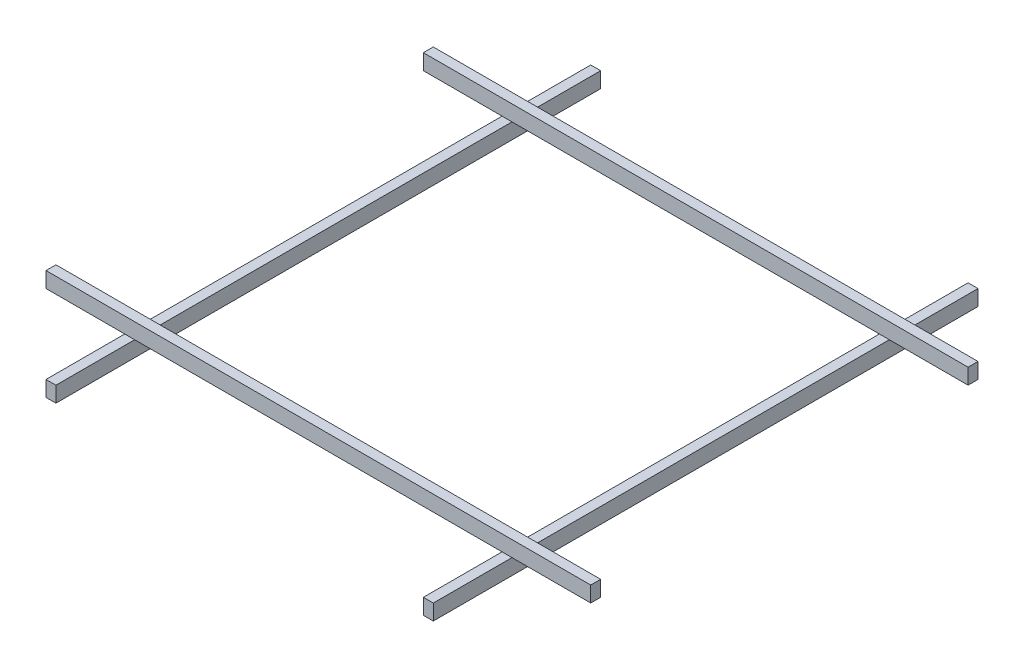
ISO-10303-21;
HEADER;
FILE_DESCRIPTION(('STEP AP214'),'2;1');
FILE_NAME('part.step','',(''),(''),'','','');
FILE_SCHEMA(('AUTOMOTIVE_DESIGN { 1 0 10303 214 1 1 1 1 }'));
ENDSEC;
DATA;
#1=APPLICATION_CONTEXT('core data for automotive mechanical design processes');
#2=APPLICATION_PROTOCOL_DEFINITION('international standard','automotive_design',2000,#1);
#3=PRODUCT_CONTEXT('',#1,'mechanical');
#4=PRODUCT('Part','Part','',(#3));
#5=PRODUCT_RELATED_PRODUCT_CATEGORY('part','',(#4));
#6=PRODUCT_DEFINITION_FORMATION('','',#4);
#7=PRODUCT_DEFINITION_CONTEXT('part definition',#1,'design');
#8=PRODUCT_DEFINITION('design','',#6,#7);
#9=PRODUCT_DEFINITION_SHAPE('','',#8);
#10=(LENGTH_UNIT() NAMED_UNIT(*) SI_UNIT(.MILLI.,.METRE.));
#11=(NAMED_UNIT(*) PLANE_ANGLE_UNIT() SI_UNIT($,.RADIAN.));
#12=(NAMED_UNIT(*) SI_UNIT($,.STERADIAN.) SOLID_ANGLE_UNIT());
#13=UNCERTAINTY_MEASURE_WITH_UNIT(LENGTH_MEASURE(1.E-05),#10,'distance_accuracy_value','');
#14=(GEOMETRIC_REPRESENTATION_CONTEXT(3) GLOBAL_UNCERTAINTY_ASSIGNED_CONTEXT((#13)) GLOBAL_UNIT_ASSIGNED_CONTEXT((#10,
#11,#12)) REPRESENTATION_CONTEXT('',''));
#15=CARTESIAN_POINT('',(0.,0.,0.));
#16=DIRECTION('',(0.,0.,1.));
#17=DIRECTION('',(1.,0.,0.));
#18=AXIS2_PLACEMENT_3D('',#15,#16,#17);
#19=CARTESIAN_POINT('',(4572.,209.55,-793.749999999999));
#20=DIRECTION('',(0.,0.,1.));
#21=DIRECTION('',(1.,0.,0.));
#22=AXIS2_PLACEMENT_3D('',#19,#20,#21);
#23=PLANE('',#22);
#24=DIRECTION('',(0.,1.,0.));
#25=VECTOR('',#24,1.);
#26=CARTESIAN_POINT('',(-304.8,209.55,-793.749999999999));
#27=LINE('',#26,#25);
#28=CARTESIAN_POINT('',(-304.8,69.85,-793.749999999999));
#29=VERTEX_POINT('',#28);
#30=CARTESIAN_POINT('',(-304.8,209.55,-793.749999999999));
#31=VERTEX_POINT('',#30);
#32=EDGE_CURVE('E141',#29,#31,#27,.T.);
#33=ORIENTED_EDGE('',*,*,#32,.T.);
#34=DIRECTION('',(-1.,0.,0.));
#35=VECTOR('',#34,1.);
#36=CARTESIAN_POINT('',(4572.,209.55,-793.749999999999));
#37=LINE('',#36,#35);
#38=CARTESIAN_POINT('',(4572.,209.55,-793.749999999999));
#39=VERTEX_POINT('',#38);
#40=EDGE_CURVE('E13',#39,#31,#37,.T.);
#41=ORIENTED_EDGE('',*,*,#40,.F.);
#42=DIRECTION('',(0.,1.,0.));
#43=VECTOR('',#42,1.);
#44=CARTESIAN_POINT('',(4572.,209.55,-793.749999999999));
#45=LINE('',#44,#43);
#46=CARTESIAN_POINT('',(4572.,69.85,-793.749999999999));
#47=VERTEX_POINT('',#46);
#48=EDGE_CURVE('E126',#47,#39,#45,.T.);
#49=ORIENTED_EDGE('',*,*,#48,.F.);
#50=DIRECTION('',(-1.,0.,0.));
#51=VECTOR('',#50,1.);
#52=CARTESIAN_POINT('',(4572.,69.85,-793.749999999999));
#53=LINE('',#52,#51);
#54=EDGE_CURVE('E137',#47,#29,#53,.T.);
#55=ORIENTED_EDGE('',*,*,#54,.T.);
#56=EDGE_LOOP('',(#33,#41,#49,#55));
#57=FACE_BOUND('',#56,.T.);
#58=ADVANCED_FACE('F72',(#57),#23,.F.);
#59=CARTESIAN_POINT('',(4572.,209.55,-704.849999999999));
#60=DIRECTION('',(0.,-1.,0.));
#61=DIRECTION('',(0.,0.,-1.));
#62=AXIS2_PLACEMENT_3D('',#59,#60,#61);
#63=PLANE('',#62);
#64=DIRECTION('',(0.,0.,1.));
#65=VECTOR('',#64,1.);
#66=CARTESIAN_POINT('',(-304.8,209.55,-704.849999999999));
#67=LINE('',#66,#65);
#68=CARTESIAN_POINT('',(-304.8,209.55,-704.849999999999));
#69=VERTEX_POINT('',#68);
#70=EDGE_CURVE('E130',#31,#69,#67,.T.);
#71=ORIENTED_EDGE('',*,*,#70,.T.);
#72=DIRECTION('',(-1.,0.,0.));
#73=VECTOR('',#72,1.);
#74=CARTESIAN_POINT('',(4572.,209.55,-704.849999999999));
#75=LINE('',#74,#73);
#76=CARTESIAN_POINT('',(4572.,209.55,-704.849999999999));
#77=VERTEX_POINT('',#76);
#78=EDGE_CURVE('E81',#77,#69,#75,.T.);
#79=ORIENTED_EDGE('',*,*,#78,.F.);
#80=DIRECTION('',(0.,0.,1.));
#81=VECTOR('',#80,1.);
#82=CARTESIAN_POINT('',(4572.,209.55,-704.849999999999));
#83=LINE('',#82,#81);
#84=EDGE_CURVE('E121',#39,#77,#83,.T.);
#85=ORIENTED_EDGE('',*,*,#84,.F.);
#86=ORIENTED_EDGE('',*,*,#40,.T.);
#87=EDGE_LOOP('',(#71,#79,#85,#86));
#88=FACE_BOUND('',#87,.T.);
#89=ADVANCED_FACE('F129',(#88),#63,.F.);
#90=CARTESIAN_POINT('',(4572.,209.55,-704.849999999999));
#91=DIRECTION('',(0.,0.,-1.));
#92=DIRECTION('',(-1.,0.,0.));
#93=AXIS2_PLACEMENT_3D('',#90,#91,#92);
#94=PLANE('',#93);
#95=DIRECTION('',(0.,-1.,0.));
#96=VECTOR('',#95,1.);
#97=CARTESIAN_POINT('',(-304.8,209.55,-704.849999999999));
#98=LINE('',#97,#96);
#99=CARTESIAN_POINT('',(-304.8,69.85,-704.849999999999));
#100=VERTEX_POINT('',#99);
#101=EDGE_CURVE('E108',#69,#100,#98,.T.);
#102=ORIENTED_EDGE('',*,*,#101,.T.);
#103=DIRECTION('',(-1.,0.,0.));
#104=VECTOR('',#103,1.);
#105=CARTESIAN_POINT('',(4572.,69.85,-704.849999999999));
#106=LINE('',#105,#104);
#107=CARTESIAN_POINT('',(4572.,69.85,-704.849999999999));
#108=VERTEX_POINT('',#107);
#109=EDGE_CURVE('E132',#108,#100,#106,.T.);
#110=ORIENTED_EDGE('',*,*,#109,.F.);
#111=DIRECTION('',(0.,-1.,0.));
#112=VECTOR('',#111,1.);
#113=CARTESIAN_POINT('',(4572.,209.55,-704.849999999999));
#114=LINE('',#113,#112);
#115=EDGE_CURVE('E124',#77,#108,#114,.T.);
#116=ORIENTED_EDGE('',*,*,#115,.F.);
#117=ORIENTED_EDGE('',*,*,#78,.T.);
#118=EDGE_LOOP('',(#102,#110,#116,#117));
#119=FACE_BOUND('',#118,.T.);
#120=ADVANCED_FACE('F133',(#119),#94,.F.);
#121=CARTESIAN_POINT('',(4572.,69.85,-704.849999999999));
#122=DIRECTION('',(0.,1.,0.));
#123=DIRECTION('',(0.,0.,1.));
#124=AXIS2_PLACEMENT_3D('',#121,#122,#123);
#125=PLANE('',#124);
#126=DIRECTION('',(0.,0.,-1.));
#127=VECTOR('',#126,1.);
#128=CARTESIAN_POINT('',(-304.8,69.85,-704.849999999999));
#129=LINE('',#128,#127);
#130=EDGE_CURVE('E114',#100,#29,#129,.T.);
#131=ORIENTED_EDGE('',*,*,#130,.T.);
#132=ORIENTED_EDGE('',*,*,#54,.F.);
#133=DIRECTION('',(0.,0.,-1.));
#134=VECTOR('',#133,1.);
#135=CARTESIAN_POINT('',(4572.,69.85,-704.849999999999));
#136=LINE('',#135,#134);
#137=EDGE_CURVE('E91',#108,#47,#136,.T.);
#138=ORIENTED_EDGE('',*,*,#137,.F.);
#139=ORIENTED_EDGE('',*,*,#109,.T.);
#140=EDGE_LOOP('',(#131,#132,#138,#139));
#141=FACE_BOUND('',#140,.T.);
#142=ADVANCED_FACE('F151',(#141),#125,.F.);
#143=CARTESIAN_POINT('',(4572.,139.7,-1193.8));
#144=DIRECTION('',(1.,0.,0.));
#145=DIRECTION('',(0.,0.,-1.));
#146=AXIS2_PLACEMENT_3D('',#143,#144,#145);
#147=PLANE('',#146);
#148=ORIENTED_EDGE('',*,*,#48,.T.);
#149=ORIENTED_EDGE('',*,*,#84,.T.);
#150=ORIENTED_EDGE('',*,*,#115,.T.);
#151=ORIENTED_EDGE('',*,*,#137,.T.);
#152=EDGE_LOOP('',(#148,#149,#150,#151));
#153=FACE_BOUND('',#152,.T.);
#154=ADVANCED_FACE('F122',(#153),#147,.T.);
#155=CARTESIAN_POINT('',(-304.8,139.7,-1193.8));
#156=DIRECTION('',(1.,0.,0.));
#157=DIRECTION('',(0.,0.,-1.));
#158=AXIS2_PLACEMENT_3D('',#155,#156,#157);
#159=PLANE('',#158);
#160=ORIENTED_EDGE('',*,*,#32,.F.);
#161=ORIENTED_EDGE('',*,*,#130,.F.);
#162=ORIENTED_EDGE('',*,*,#101,.F.);
#163=ORIENTED_EDGE('',*,*,#70,.F.);
#164=EDGE_LOOP('',(#160,#161,#162,#163));
#165=FACE_BOUND('',#164,.T.);
#166=ADVANCED_FACE('F154',(#165),#159,.F.);
#167=CLOSED_SHELL('',(#58,#89,#120,#142,#154,#166));
#168=MANIFOLD_SOLID_BREP('B2',#167);
#169=CARTESIAN_POINT('',(4572.,209.55,-4171.95));
#170=DIRECTION('',(0.,0.,1.));
#171=DIRECTION('',(1.,0.,0.));
#172=AXIS2_PLACEMENT_3D('',#169,#170,#171);
#173=PLANE('',#172);
#174=DIRECTION('',(0.,1.,0.));
#175=VECTOR('',#174,1.);
#176=CARTESIAN_POINT('',(-304.8,209.55,-4171.95));
#177=LINE('',#176,#175);
#178=CARTESIAN_POINT('',(-304.8,69.85,-4171.95));
#179=VERTEX_POINT('',#178);
#180=CARTESIAN_POINT('',(-304.8,209.55,-4171.95));
#181=VERTEX_POINT('',#180);
#182=EDGE_CURVE('E304',#179,#181,#177,.T.);
#183=ORIENTED_EDGE('',*,*,#182,.T.);
#184=DIRECTION('',(-1.,0.,0.));
#185=VECTOR('',#184,1.);
#186=CARTESIAN_POINT('',(4572.,209.55,-4171.95));
#187=LINE('',#186,#185);
#188=CARTESIAN_POINT('',(4572.,209.55,-4171.95));
#189=VERTEX_POINT('',#188);
#190=EDGE_CURVE('E70',#189,#181,#187,.T.);
#191=ORIENTED_EDGE('',*,*,#190,.F.);
#192=DIRECTION('',(0.,1.,0.));
#193=VECTOR('',#192,1.);
#194=CARTESIAN_POINT('',(4572.,209.55,-4171.95));
#195=LINE('',#194,#193);
#196=CARTESIAN_POINT('',(4572.,69.85,-4171.95));
#197=VERTEX_POINT('',#196);
#198=EDGE_CURVE('E291',#197,#189,#195,.T.);
#199=ORIENTED_EDGE('',*,*,#198,.F.);
#200=DIRECTION('',(-1.,0.,0.));
#201=VECTOR('',#200,1.);
#202=CARTESIAN_POINT('',(4572.,69.85,-4171.95));
#203=LINE('',#202,#201);
#204=EDGE_CURVE('E300',#197,#179,#203,.T.);
#205=ORIENTED_EDGE('',*,*,#204,.T.);
#206=EDGE_LOOP('',(#183,#191,#199,#205));
#207=FACE_BOUND('',#206,.T.);
#208=ADVANCED_FACE('F239',(#207),#173,.F.);
#209=CARTESIAN_POINT('',(4572.,209.55,-4083.05));
#210=DIRECTION('',(0.,-1.,0.));
#211=DIRECTION('',(0.,0.,-1.));
#212=AXIS2_PLACEMENT_3D('',#209,#210,#211);
#213=PLANE('',#212);
#214=DIRECTION('',(0.,0.,1.));
#215=VECTOR('',#214,1.);
#216=CARTESIAN_POINT('',(-304.8,209.55,-4083.05));
#217=LINE('',#216,#215);
#218=CARTESIAN_POINT('',(-304.8,209.55,-4083.05));
#219=VERTEX_POINT('',#218);
#220=EDGE_CURVE('E295',#181,#219,#217,.T.);
#221=ORIENTED_EDGE('',*,*,#220,.T.);
#222=DIRECTION('',(-1.,0.,0.));
#223=VECTOR('',#222,1.);
#224=CARTESIAN_POINT('',(4572.,209.55,-4083.05));
#225=LINE('',#224,#223);
#226=CARTESIAN_POINT('',(4572.,209.55,-4083.05));
#227=VERTEX_POINT('',#226);
#228=EDGE_CURVE('E248',#227,#219,#225,.T.);
#229=ORIENTED_EDGE('',*,*,#228,.F.);
#230=DIRECTION('',(0.,0.,1.));
#231=VECTOR('',#230,1.);
#232=CARTESIAN_POINT('',(4572.,209.55,-4083.05));
#233=LINE('',#232,#231);
#234=EDGE_CURVE('E286',#189,#227,#233,.T.);
#235=ORIENTED_EDGE('',*,*,#234,.F.);
#236=ORIENTED_EDGE('',*,*,#190,.T.);
#237=EDGE_LOOP('',(#221,#229,#235,#236));
#238=FACE_BOUND('',#237,.T.);
#239=ADVANCED_FACE('F294',(#238),#213,.F.);
#240=CARTESIAN_POINT('',(4572.,209.55,-4083.05));
#241=DIRECTION('',(0.,0.,-1.));
#242=DIRECTION('',(-1.,0.,0.));
#243=AXIS2_PLACEMENT_3D('',#240,#241,#242);
#244=PLANE('',#243);
#245=DIRECTION('',(0.,-1.,0.));
#246=VECTOR('',#245,1.);
#247=CARTESIAN_POINT('',(-304.8,209.55,-4083.05));
#248=LINE('',#247,#246);
#249=CARTESIAN_POINT('',(-304.8,69.85,-4083.05));
#250=VERTEX_POINT('',#249);
#251=EDGE_CURVE('E273',#219,#250,#248,.T.);
#252=ORIENTED_EDGE('',*,*,#251,.T.);
#253=DIRECTION('',(-1.,0.,0.));
#254=VECTOR('',#253,1.);
#255=CARTESIAN_POINT('',(4572.,69.85,-4083.05));
#256=LINE('',#255,#254);
#257=CARTESIAN_POINT('',(4572.,69.85,-4083.05));
#258=VERTEX_POINT('',#257);
#259=EDGE_CURVE('E297',#258,#250,#256,.T.);
#260=ORIENTED_EDGE('',*,*,#259,.F.);
#261=DIRECTION('',(0.,-1.,0.));
#262=VECTOR('',#261,1.);
#263=CARTESIAN_POINT('',(4572.,209.55,-4083.05));
#264=LINE('',#263,#262);
#265=EDGE_CURVE('E289',#227,#258,#264,.T.);
#266=ORIENTED_EDGE('',*,*,#265,.F.);
#267=ORIENTED_EDGE('',*,*,#228,.T.);
#268=EDGE_LOOP('',(#252,#260,#266,#267));
#269=FACE_BOUND('',#268,.T.);
#270=ADVANCED_FACE('F298',(#269),#244,.F.);
#271=CARTESIAN_POINT('',(4572.,69.85,-4083.05));
#272=DIRECTION('',(0.,1.,0.));
#273=DIRECTION('',(0.,0.,1.));
#274=AXIS2_PLACEMENT_3D('',#271,#272,#273);
#275=PLANE('',#274);
#276=DIRECTION('',(0.,0.,-1.));
#277=VECTOR('',#276,1.);
#278=CARTESIAN_POINT('',(-304.8,69.85,-4083.05));
#279=LINE('',#278,#277);
#280=EDGE_CURVE('E279',#250,#179,#279,.T.);
#281=ORIENTED_EDGE('',*,*,#280,.T.);
#282=ORIENTED_EDGE('',*,*,#204,.F.);
#283=DIRECTION('',(0.,0.,-1.));
#284=VECTOR('',#283,1.);
#285=CARTESIAN_POINT('',(4572.,69.85,-4083.05));
#286=LINE('',#285,#284);
#287=EDGE_CURVE('E256',#258,#197,#286,.T.);
#288=ORIENTED_EDGE('',*,*,#287,.F.);
#289=ORIENTED_EDGE('',*,*,#259,.T.);
#290=EDGE_LOOP('',(#281,#282,#288,#289));
#291=FACE_BOUND('',#290,.T.);
#292=ADVANCED_FACE('F313',(#291),#275,.F.);
#293=CARTESIAN_POINT('',(4572.,139.7,-4572.));
#294=DIRECTION('',(1.,0.,0.));
#295=DIRECTION('',(0.,0.,-1.));
#296=AXIS2_PLACEMENT_3D('',#293,#294,#295);
#297=PLANE('',#296);
#298=ORIENTED_EDGE('',*,*,#198,.T.);
#299=ORIENTED_EDGE('',*,*,#234,.T.);
#300=ORIENTED_EDGE('',*,*,#265,.T.);
#301=ORIENTED_EDGE('',*,*,#287,.T.);
#302=EDGE_LOOP('',(#298,#299,#300,#301));
#303=FACE_BOUND('',#302,.T.);
#304=ADVANCED_FACE('F287',(#303),#297,.T.);
#305=CARTESIAN_POINT('',(-304.8,139.7,-4572.));
#306=DIRECTION('',(1.,0.,0.));
#307=DIRECTION('',(0.,0.,-1.));
#308=AXIS2_PLACEMENT_3D('',#305,#306,#307);
#309=PLANE('',#308);
#310=ORIENTED_EDGE('',*,*,#182,.F.);
#311=ORIENTED_EDGE('',*,*,#280,.F.);
#312=ORIENTED_EDGE('',*,*,#251,.F.);
#313=ORIENTED_EDGE('',*,*,#220,.F.);
#314=EDGE_LOOP('',(#310,#311,#312,#313));
#315=FACE_BOUND('',#314,.T.);
#316=ADVANCED_FACE('F316',(#315),#309,.F.);
#317=CLOSED_SHELL('',(#208,#239,#270,#292,#304,#316));
#318=MANIFOLD_SOLID_BREP('B7',#317);
#319=CARTESIAN_POINT('',(3778.25,69.85,-4876.8));
#320=DIRECTION('',(1.,0.,0.));
#321=DIRECTION('',(0.,0.,-1.));
#322=AXIS2_PLACEMENT_3D('',#319,#320,#321);
#323=PLANE('',#322);
#324=DIRECTION('',(0.,1.,0.));
#325=VECTOR('',#324,1.);
#326=CARTESIAN_POINT('',(3778.25,69.85,0.));
#327=LINE('',#326,#325);
#328=CARTESIAN_POINT('',(3778.25,-69.85,0.));
#329=VERTEX_POINT('',#328);
#330=CARTESIAN_POINT('',(3778.25,69.85,0.));
#331=VERTEX_POINT('',#330);
#332=EDGE_CURVE('E474',#329,#331,#327,.T.);
#333=ORIENTED_EDGE('',*,*,#332,.T.);
#334=DIRECTION('',(0.,0.,1.));
#335=VECTOR('',#334,1.);
#336=CARTESIAN_POINT('',(3778.25,69.85,-4876.8));
#337=LINE('',#336,#335);
#338=CARTESIAN_POINT('',(3778.25,69.85,-4876.8));
#339=VERTEX_POINT('',#338);
#340=EDGE_CURVE('E237',#339,#331,#337,.T.);
#341=ORIENTED_EDGE('',*,*,#340,.F.);
#342=DIRECTION('',(0.,1.,0.));
#343=VECTOR('',#342,1.);
#344=CARTESIAN_POINT('',(3778.25,69.85,-4876.8));
#345=LINE('',#344,#343);
#346=CARTESIAN_POINT('',(3778.25,-69.85,-4876.8));
#347=VERTEX_POINT('',#346);
#348=EDGE_CURVE('E458',#347,#339,#345,.T.);
#349=ORIENTED_EDGE('',*,*,#348,.F.);
#350=DIRECTION('',(0.,0.,1.));
#351=VECTOR('',#350,1.);
#352=CARTESIAN_POINT('',(3778.25,-69.85,-4876.8));
#353=LINE('',#352,#351);
#354=EDGE_CURVE('E470',#347,#329,#353,.T.);
#355=ORIENTED_EDGE('',*,*,#354,.T.);
#356=EDGE_LOOP('',(#333,#341,#349,#355));
#357=FACE_BOUND('',#356,.T.);
#358=ADVANCED_FACE('F402',(#357),#323,.F.);
#359=CARTESIAN_POINT('',(3867.15,69.85,-4876.8));
#360=DIRECTION('',(0.,-1.,0.));
#361=DIRECTION('',(0.,0.,-1.));
#362=AXIS2_PLACEMENT_3D('',#359,#360,#361);
#363=PLANE('',#362);
#364=DIRECTION('',(1.,0.,0.));
#365=VECTOR('',#364,1.);
#366=CARTESIAN_POINT('',(3867.15,69.85,0.));
#367=LINE('',#366,#365);
#368=CARTESIAN_POINT('',(3867.15,69.85,0.));
#369=VERTEX_POINT('',#368);
#370=EDGE_CURVE('E462',#331,#369,#367,.T.);
#371=ORIENTED_EDGE('',*,*,#370,.T.);
#372=DIRECTION('',(0.,0.,1.));
#373=VECTOR('',#372,1.);
#374=CARTESIAN_POINT('',(3867.15,69.85,-4876.8));
#375=LINE('',#374,#373);
#376=CARTESIAN_POINT('',(3867.15,69.85,-4876.8));
#377=VERTEX_POINT('',#376);
#378=EDGE_CURVE('E411',#377,#369,#375,.T.);
#379=ORIENTED_EDGE('',*,*,#378,.F.);
#380=DIRECTION('',(1.,0.,0.));
#381=VECTOR('',#380,1.);
#382=CARTESIAN_POINT('',(3867.15,69.85,-4876.8));
#383=LINE('',#382,#381);
#384=EDGE_CURVE('E453',#339,#377,#383,.T.);
#385=ORIENTED_EDGE('',*,*,#384,.F.);
#386=ORIENTED_EDGE('',*,*,#340,.T.);
#387=EDGE_LOOP('',(#371,#379,#385,#386));
#388=FACE_BOUND('',#387,.T.);
#389=ADVANCED_FACE('F461',(#388),#363,.F.);
#390=CARTESIAN_POINT('',(3867.15,69.85,-4876.8));
#391=DIRECTION('',(-1.,0.,0.));
#392=DIRECTION('',(0.,0.,1.));
#393=AXIS2_PLACEMENT_3D('',#390,#391,#392);
#394=PLANE('',#393);
#395=DIRECTION('',(0.,-1.,0.));
#396=VECTOR('',#395,1.);
#397=CARTESIAN_POINT('',(3867.15,69.85,0.));
#398=LINE('',#397,#396);
#399=CARTESIAN_POINT('',(3867.15,-69.85,0.));
#400=VERTEX_POINT('',#399);
#401=EDGE_CURVE('E440',#369,#400,#398,.T.);
#402=ORIENTED_EDGE('',*,*,#401,.T.);
#403=DIRECTION('',(0.,0.,1.));
#404=VECTOR('',#403,1.);
#405=CARTESIAN_POINT('',(3867.15,-69.85,-4876.8));
#406=LINE('',#405,#404);
#407=CARTESIAN_POINT('',(3867.15,-69.85,-4876.8));
#408=VERTEX_POINT('',#407);
#409=EDGE_CURVE('E464',#408,#400,#406,.T.);
#410=ORIENTED_EDGE('',*,*,#409,.F.);
#411=DIRECTION('',(0.,-1.,0.));
#412=VECTOR('',#411,1.);
#413=CARTESIAN_POINT('',(3867.15,69.85,-4876.8));
#414=LINE('',#413,#412);
#415=EDGE_CURVE('E456',#377,#408,#414,.T.);
#416=ORIENTED_EDGE('',*,*,#415,.F.);
#417=ORIENTED_EDGE('',*,*,#378,.T.);
#418=EDGE_LOOP('',(#402,#410,#416,#417));
#419=FACE_BOUND('',#418,.T.);
#420=ADVANCED_FACE('F465',(#419),#394,.F.);
#421=CARTESIAN_POINT('',(3867.15,-69.85,-4876.8));
#422=DIRECTION('',(0.,1.,0.));
#423=DIRECTION('',(0.,0.,1.));
#424=AXIS2_PLACEMENT_3D('',#421,#422,#423);
#425=PLANE('',#424);
#426=DIRECTION('',(-1.,0.,0.));
#427=VECTOR('',#426,1.);
#428=CARTESIAN_POINT('',(3867.15,-69.85,0.));
#429=LINE('',#428,#427);
#430=EDGE_CURVE('E446',#400,#329,#429,.T.);
#431=ORIENTED_EDGE('',*,*,#430,.T.);
#432=ORIENTED_EDGE('',*,*,#354,.F.);
#433=DIRECTION('',(-1.,0.,0.));
#434=VECTOR('',#433,1.);
#435=CARTESIAN_POINT('',(3867.15,-69.85,-4876.8));
#436=LINE('',#435,#434);
#437=EDGE_CURVE('E422',#408,#347,#436,.T.);
#438=ORIENTED_EDGE('',*,*,#437,.F.);
#439=ORIENTED_EDGE('',*,*,#409,.T.);
#440=EDGE_LOOP('',(#431,#432,#438,#439));
#441=FACE_BOUND('',#440,.T.);
#442=ADVANCED_FACE('F486',(#441),#425,.F.);
#443=CARTESIAN_POINT('',(3378.2,0.,-4876.8));
#444=DIRECTION('',(0.,0.,-1.));
#445=DIRECTION('',(-1.,0.,0.));
#446=AXIS2_PLACEMENT_3D('',#443,#444,#445);
#447=PLANE('',#446);
#448=ORIENTED_EDGE('',*,*,#348,.T.);
#449=ORIENTED_EDGE('',*,*,#384,.T.);
#450=ORIENTED_EDGE('',*,*,#415,.T.);
#451=ORIENTED_EDGE('',*,*,#437,.T.);
#452=EDGE_LOOP('',(#448,#449,#450,#451));
#453=FACE_BOUND('',#452,.T.);
#454=ADVANCED_FACE('F454',(#453),#447,.T.);
#455=CARTESIAN_POINT('',(3378.2,0.,0.));
#456=DIRECTION('',(0.,0.,-1.));
#457=DIRECTION('',(-1.,0.,0.));
#458=AXIS2_PLACEMENT_3D('',#455,#456,#457);
#459=PLANE('',#458);
#460=ORIENTED_EDGE('',*,*,#332,.F.);
#461=ORIENTED_EDGE('',*,*,#430,.F.);
#462=ORIENTED_EDGE('',*,*,#401,.F.);
#463=ORIENTED_EDGE('',*,*,#370,.F.);
#464=EDGE_LOOP('',(#460,#461,#462,#463));
#465=FACE_BOUND('',#464,.T.);
#466=ADVANCED_FACE('F489',(#465),#459,.F.);
#467=CLOSED_SHELL('',(#358,#389,#420,#442,#454,#466));
#468=MANIFOLD_SOLID_BREP('B64',#467);
#469=CARTESIAN_POINT('',(400.05,69.85,-4876.8));
#470=DIRECTION('',(1.,0.,0.));
#471=DIRECTION('',(0.,0.,-1.));
#472=AXIS2_PLACEMENT_3D('',#469,#470,#471);
#473=PLANE('',#472);
#474=DIRECTION('',(0.,1.,0.));
#475=VECTOR('',#474,1.);
#476=CARTESIAN_POINT('',(400.05,69.85,8.88178419700125E-13));
#477=LINE('',#476,#475);
#478=CARTESIAN_POINT('',(400.05,-69.85,8.88178419700125E-13));
#479=VERTEX_POINT('',#478);
#480=CARTESIAN_POINT('',(400.05,69.85,8.88178419700125E-13));
#481=VERTEX_POINT('',#480);
#482=EDGE_CURVE('E627',#479,#481,#477,.T.);
#483=ORIENTED_EDGE('',*,*,#482,.T.);
#484=DIRECTION('',(0.,0.,1.));
#485=VECTOR('',#484,1.);
#486=CARTESIAN_POINT('',(400.05,69.85,-4876.8));
#487=LINE('',#486,#485);
#488=CARTESIAN_POINT('',(400.05,69.85,-4876.8));
#489=VERTEX_POINT('',#488);
#490=EDGE_CURVE('E400',#489,#481,#487,.T.);
#491=ORIENTED_EDGE('',*,*,#490,.F.);
#492=DIRECTION('',(0.,1.,0.));
#493=VECTOR('',#492,1.);
#494=CARTESIAN_POINT('',(400.05,69.85,-4876.8));
#495=LINE('',#494,#493);
#496=CARTESIAN_POINT('',(400.05,-69.85,-4876.8));
#497=VERTEX_POINT('',#496);
#498=EDGE_CURVE('E615',#497,#489,#495,.T.);
#499=ORIENTED_EDGE('',*,*,#498,.F.);
#500=DIRECTION('',(0.,0.,1.));
#501=VECTOR('',#500,1.);
#502=CARTESIAN_POINT('',(400.05,-69.85,-4876.8));
#503=LINE('',#502,#501);
#504=EDGE_CURVE('E623',#497,#479,#503,.T.);
#505=ORIENTED_EDGE('',*,*,#504,.T.);
#506=EDGE_LOOP('',(#483,#491,#499,#505));
#507=FACE_BOUND('',#506,.T.);
#508=ADVANCED_FACE('F564',(#507),#473,.F.);
#509=CARTESIAN_POINT('',(488.95,69.85,-4876.8));
#510=DIRECTION('',(0.,-1.,0.));
#511=DIRECTION('',(0.,0.,-1.));
#512=AXIS2_PLACEMENT_3D('',#509,#510,#511);
#513=PLANE('',#512);
#514=DIRECTION('',(1.,0.,0.));
#515=VECTOR('',#514,1.);
#516=CARTESIAN_POINT('',(488.95,69.85,8.88178419700125E-13));
#517=LINE('',#516,#515);
#518=CARTESIAN_POINT('',(488.95,69.85,8.88178419700125E-13));
#519=VERTEX_POINT('',#518);
#520=EDGE_CURVE('E619',#481,#519,#517,.T.);
#521=ORIENTED_EDGE('',*,*,#520,.T.);
#522=DIRECTION('',(0.,0.,1.));
#523=VECTOR('',#522,1.);
#524=CARTESIAN_POINT('',(488.95,69.85,-4876.8));
#525=LINE('',#524,#523);
#526=CARTESIAN_POINT('',(488.95,69.85,-4876.8));
#527=VERTEX_POINT('',#526);
#528=EDGE_CURVE('E572',#527,#519,#525,.T.);
#529=ORIENTED_EDGE('',*,*,#528,.F.);
#530=DIRECTION('',(1.,0.,0.));
#531=VECTOR('',#530,1.);
#532=CARTESIAN_POINT('',(488.95,69.85,-4876.8));
#533=LINE('',#532,#531);
#534=EDGE_CURVE('E610',#489,#527,#533,.T.);
#535=ORIENTED_EDGE('',*,*,#534,.F.);
#536=ORIENTED_EDGE('',*,*,#490,.T.);
#537=EDGE_LOOP('',(#521,#529,#535,#536));
#538=FACE_BOUND('',#537,.T.);
#539=ADVANCED_FACE('F618',(#538),#513,.F.);
#540=CARTESIAN_POINT('',(488.95,69.85,-4876.8));
#541=DIRECTION('',(-1.,0.,0.));
#542=DIRECTION('',(0.,0.,1.));
#543=AXIS2_PLACEMENT_3D('',#540,#541,#542);
#544=PLANE('',#543);
#545=DIRECTION('',(0.,-1.,0.));
#546=VECTOR('',#545,1.);
#547=CARTESIAN_POINT('',(488.95,69.85,8.88178419700125E-13));
#548=LINE('',#547,#546);
#549=CARTESIAN_POINT('',(488.95,-69.85,8.88178419700125E-13));
#550=VERTEX_POINT('',#549);
#551=EDGE_CURVE('E597',#519,#550,#548,.T.);
#552=ORIENTED_EDGE('',*,*,#551,.T.);
#553=DIRECTION('',(0.,0.,1.));
#554=VECTOR('',#553,1.);
#555=CARTESIAN_POINT('',(488.95,-69.85,-4876.8));
#556=LINE('',#555,#554);
#557=CARTESIAN_POINT('',(488.95,-69.85,-4876.8));
#558=VERTEX_POINT('',#557);
#559=EDGE_CURVE('E620',#558,#550,#556,.T.);
#560=ORIENTED_EDGE('',*,*,#559,.F.);
#561=DIRECTION('',(0.,-1.,0.));
#562=VECTOR('',#561,1.);
#563=CARTESIAN_POINT('',(488.95,69.85,-4876.8));
#564=LINE('',#563,#562);
#565=EDGE_CURVE('E613',#527,#558,#564,.T.);
#566=ORIENTED_EDGE('',*,*,#565,.F.);
#567=ORIENTED_EDGE('',*,*,#528,.T.);
#568=EDGE_LOOP('',(#552,#560,#566,#567));
#569=FACE_BOUND('',#568,.T.);
#570=ADVANCED_FACE('F621',(#569),#544,.F.);
#571=CARTESIAN_POINT('',(488.95,-69.85,-4876.8));
#572=DIRECTION('',(0.,1.,0.));
#573=DIRECTION('',(0.,0.,1.));
#574=AXIS2_PLACEMENT_3D('',#571,#572,#573);
#575=PLANE('',#574);
#576=DIRECTION('',(-1.,0.,0.));
#577=VECTOR('',#576,1.);
#578=CARTESIAN_POINT('',(488.95,-69.85,8.88178419700125E-13));
#579=LINE('',#578,#577);
#580=EDGE_CURVE('E603',#550,#479,#579,.T.);
#581=ORIENTED_EDGE('',*,*,#580,.T.);
#582=ORIENTED_EDGE('',*,*,#504,.F.);
#583=DIRECTION('',(-1.,0.,0.));
#584=VECTOR('',#583,1.);
#585=CARTESIAN_POINT('',(488.95,-69.85,-4876.8));
#586=LINE('',#585,#584);
#587=EDGE_CURVE('E580',#558,#497,#586,.T.);
#588=ORIENTED_EDGE('',*,*,#587,.F.);
#589=ORIENTED_EDGE('',*,*,#559,.T.);
#590=EDGE_LOOP('',(#581,#582,#588,#589));
#591=FACE_BOUND('',#590,.T.);
#592=ADVANCED_FACE('F636',(#591),#575,.F.);
#593=CARTESIAN_POINT('',(0.,0.,-4876.8));
#594=DIRECTION('',(0.,0.,-1.));
#595=DIRECTION('',(-1.,0.,0.));
#596=AXIS2_PLACEMENT_3D('',#593,#594,#595);
#597=PLANE('',#596);
#598=ORIENTED_EDGE('',*,*,#498,.T.);
#599=ORIENTED_EDGE('',*,*,#534,.T.);
#600=ORIENTED_EDGE('',*,*,#565,.T.);
#601=ORIENTED_EDGE('',*,*,#587,.T.);
#602=EDGE_LOOP('',(#598,#599,#600,#601));
#603=FACE_BOUND('',#602,.T.);
#604=ADVANCED_FACE('F611',(#603),#597,.T.);
#605=CARTESIAN_POINT('',(0.,0.,8.88178419700125E-13));
#606=DIRECTION('',(0.,0.,-1.));
#607=DIRECTION('',(-1.,0.,0.));
#608=AXIS2_PLACEMENT_3D('',#605,#606,#607);
#609=PLANE('',#608);
#610=ORIENTED_EDGE('',*,*,#482,.F.);
#611=ORIENTED_EDGE('',*,*,#580,.F.);
#612=ORIENTED_EDGE('',*,*,#551,.F.);
#613=ORIENTED_EDGE('',*,*,#520,.F.);
#614=EDGE_LOOP('',(#610,#611,#612,#613));
#615=FACE_BOUND('',#614,.T.);
#616=ADVANCED_FACE('F639',(#615),#609,.F.);
#617=CLOSED_SHELL('',(#508,#539,#570,#592,#604,#616));
#618=MANIFOLD_SOLID_BREP('B231',#617);
#619=ADVANCED_BREP_SHAPE_REPRESENTATION('',(#18,#168,#318,#468,#618),#14);
#620=SHAPE_DEFINITION_REPRESENTATION(#9,#619);
ENDSEC;
END-ISO-10303-21;
